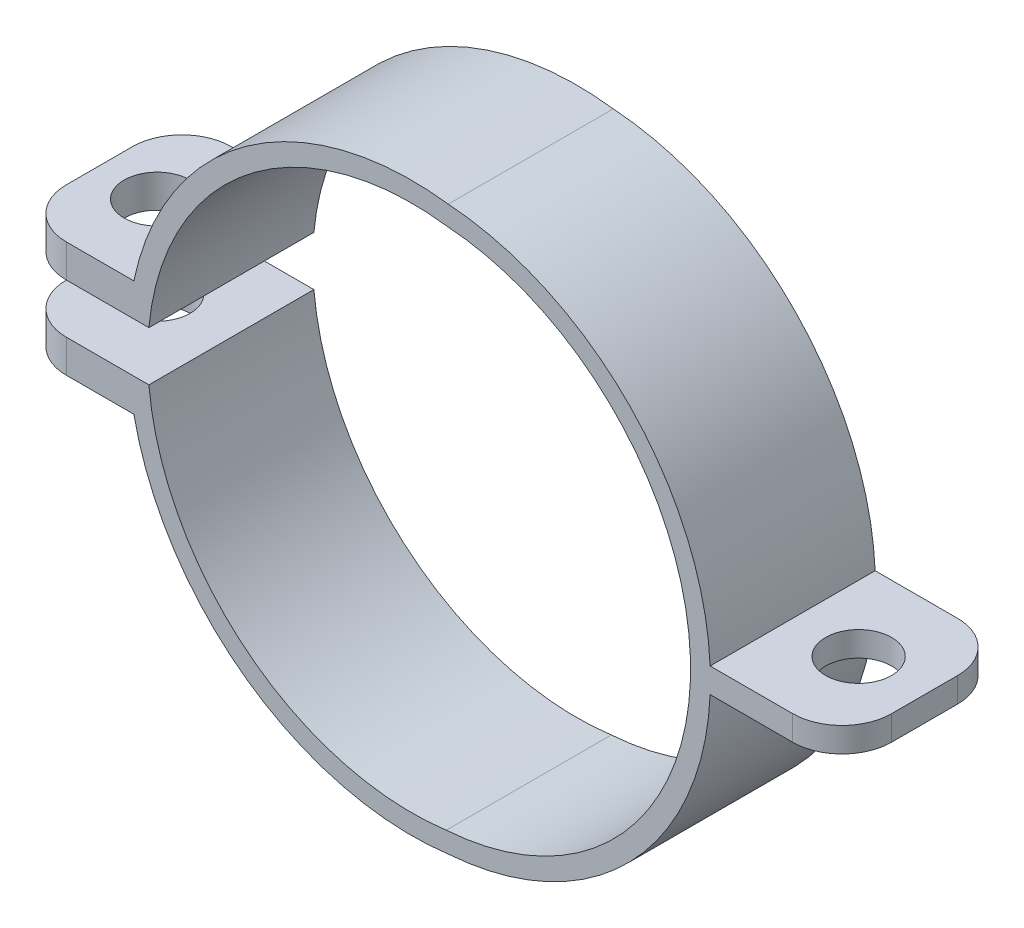
ISO-10303-21;
HEADER;
FILE_DESCRIPTION(('STEP AP214'),'2;1');
FILE_NAME('part.step','',(''),(''),'','','');
FILE_SCHEMA(('AUTOMOTIVE_DESIGN { 1 0 10303 214 1 1 1 1 }'));
ENDSEC;
DATA;
#1=APPLICATION_CONTEXT('core data for automotive mechanical design processes');
#2=APPLICATION_PROTOCOL_DEFINITION('international standard','automotive_design',2000,#1);
#3=PRODUCT_CONTEXT('',#1,'mechanical');
#4=PRODUCT('Part','Part','',(#3));
#5=PRODUCT_RELATED_PRODUCT_CATEGORY('part','',(#4));
#6=PRODUCT_DEFINITION_FORMATION('','',#4);
#7=PRODUCT_DEFINITION_CONTEXT('part definition',#1,'design');
#8=PRODUCT_DEFINITION('design','',#6,#7);
#9=PRODUCT_DEFINITION_SHAPE('','',#8);
#10=(LENGTH_UNIT() NAMED_UNIT(*) SI_UNIT(.MILLI.,.METRE.));
#11=(NAMED_UNIT(*) PLANE_ANGLE_UNIT() SI_UNIT($,.RADIAN.));
#12=(NAMED_UNIT(*) SI_UNIT($,.STERADIAN.) SOLID_ANGLE_UNIT());
#13=UNCERTAINTY_MEASURE_WITH_UNIT(LENGTH_MEASURE(1.E-05),#10,'distance_accuracy_value','');
#14=(GEOMETRIC_REPRESENTATION_CONTEXT(3) GLOBAL_UNCERTAINTY_ASSIGNED_CONTEXT((#13)) GLOBAL_UNIT_ASSIGNED_CONTEXT((#10,
#11,#12)) REPRESENTATION_CONTEXT('',''));
#15=CARTESIAN_POINT('',(0.,0.,0.));
#16=DIRECTION('',(0.,0.,1.));
#17=DIRECTION('',(1.,0.,0.));
#18=AXIS2_PLACEMENT_3D('',#15,#16,#17);
#19=CARTESIAN_POINT('',(0.,0.,-5.));
#20=DIRECTION('',(0.,0.,1.));
#21=DIRECTION('',(1.,0.,0.));
#22=AXIS2_PLACEMENT_3D('',#19,#20,#21);
#23=CYLINDRICAL_SURFACE('',#22,17.1);
#24=DIRECTION('',(0.,0.,1.));
#25=VECTOR('',#24,1.);
#26=CARTESIAN_POINT('',(17.0835447141394,0.75,-5.));
#27=LINE('',#26,#25);
#28=CARTESIAN_POINT('',(17.0835447141394,0.75,-5.));
#29=VERTEX_POINT('',#28);
#30=CARTESIAN_POINT('',(17.0835447141394,0.75,5.));
#31=VERTEX_POINT('',#30);
#32=EDGE_CURVE('E284',#29,#31,#27,.T.);
#33=ORIENTED_EDGE('',*,*,#32,.F.);
#34=CARTESIAN_POINT('',(0.,0.,-5.));
#35=DIRECTION('',(0.,0.,1.));
#36=DIRECTION('',(1.,0.,0.));
#37=AXIS2_PLACEMENT_3D('',#34,#35,#36);
#38=CIRCLE('',#37,17.1);
#39=CARTESIAN_POINT('',(1.21500000000011,17.0567809096558,-5.));
#40=VERTEX_POINT('',#39);
#41=EDGE_CURVE('E241',#29,#40,#38,.T.);
#42=ORIENTED_EDGE('',*,*,#41,.T.);
#43=DIRECTION('',(0.,0.,1.));
#44=VECTOR('',#43,1.);
#45=CARTESIAN_POINT('',(1.21500000000011,17.0567809096558,-5.));
#46=LINE('',#45,#44);
#47=CARTESIAN_POINT('',(1.21500000000011,17.0567809096558,5.));
#48=VERTEX_POINT('',#47);
#49=EDGE_CURVE('E261',#40,#48,#46,.T.);
#50=ORIENTED_EDGE('',*,*,#49,.T.);
#51=CARTESIAN_POINT('',(0.,0.,5.));
#52=DIRECTION('',(0.,0.,1.));
#53=DIRECTION('',(1.,0.,0.));
#54=AXIS2_PLACEMENT_3D('',#51,#52,#53);
#55=CIRCLE('',#54,17.1);
#56=EDGE_CURVE('E212',#31,#48,#55,.T.);
#57=ORIENTED_EDGE('',*,*,#56,.F.);
#58=EDGE_LOOP('',(#33,#42,#50,#57));
#59=FACE_BOUND('',#58,.T.);
#60=ADVANCED_FACE('F33',(#59),#23,.T.);
#61=CARTESIAN_POINT('',(-1.,0.,-5.));
#62=DIRECTION('',(0.,0.,1.));
#63=DIRECTION('',(1.,0.,0.));
#64=AXIS2_PLACEMENT_3D('',#61,#62,#63);
#65=CYLINDRICAL_SURFACE('',#64,16.);
#66=DIRECTION('',(0.,0.,1.));
#67=VECTOR('',#66,1.);
#68=CARTESIAN_POINT('',(1.0950000000001,15.8622499980299,-5.));
#69=LINE('',#68,#67);
#70=CARTESIAN_POINT('',(1.0950000000001,15.8622499980299,-5.));
#71=VERTEX_POINT('',#70);
#72=CARTESIAN_POINT('',(1.0950000000001,15.8622499980299,5.));
#73=VERTEX_POINT('',#72);
#74=EDGE_CURVE('E250',#71,#73,#69,.T.);
#75=ORIENTED_EDGE('',*,*,#74,.T.);
#76=CARTESIAN_POINT('',(-1.,0.,5.));
#77=DIRECTION('',(0.,0.,-1.));
#78=DIRECTION('',(1.,0.,0.));
#79=AXIS2_PLACEMENT_3D('',#76,#77,#78);
#80=CIRCLE('',#79,16.);
#81=CARTESIAN_POINT('',(-16.929532322074,1.5,5.));
#82=VERTEX_POINT('',#81);
#83=EDGE_CURVE('E362',#82,#73,#80,.T.);
#84=ORIENTED_EDGE('',*,*,#83,.F.);
#85=DIRECTION('',(0.,0.,1.));
#86=VECTOR('',#85,1.);
#87=CARTESIAN_POINT('',(-16.929532322074,1.5,-5.));
#88=LINE('',#87,#86);
#89=CARTESIAN_POINT('',(-16.929532322074,1.5,-5.));
#90=VERTEX_POINT('',#89);
#91=EDGE_CURVE('E251',#90,#82,#88,.T.);
#92=ORIENTED_EDGE('',*,*,#91,.F.);
#93=CARTESIAN_POINT('',(-1.,0.,-5.));
#94=DIRECTION('',(0.,0.,-1.));
#95=DIRECTION('',(1.,0.,0.));
#96=AXIS2_PLACEMENT_3D('',#93,#94,#95);
#97=CIRCLE('',#96,16.);
#98=EDGE_CURVE('E224',#90,#71,#97,.T.);
#99=ORIENTED_EDGE('',*,*,#98,.T.);
#100=EDGE_LOOP('',(#75,#84,#92,#99));
#101=FACE_BOUND('',#100,.T.);
#102=ADVANCED_FACE('F358',(#101),#65,.F.);
#103=CARTESIAN_POINT('',(-16.929532322074,1.5,-5.));
#104=DIRECTION('',(0.,-1.,0.));
#105=DIRECTION('',(1.,0.,0.));
#106=AXIS2_PLACEMENT_3D('',#103,#104,#105);
#107=PLANE('',#106);
#108=CARTESIAN_POINT('',(-21.429532322074,1.5,0.));
#109=DIRECTION('',(0.,-1.,0.));
#110=DIRECTION('',(1.,0.,0.));
#111=AXIS2_PLACEMENT_3D('',#108,#109,#110);
#112=CIRCLE('',#111,2.);
#113=CARTESIAN_POINT('',(-19.429532322074,1.5,0.));
#114=VERTEX_POINT('',#113);
#115=EDGE_CURVE('E365',#114,#114,#112,.T.);
#116=ORIENTED_EDGE('',*,*,#115,.F.);
#117=EDGE_LOOP('',(#116));
#118=FACE_BOUND('',#117,.T.);
#119=DIRECTION('',(0.,0.,1.));
#120=VECTOR('',#119,1.);
#121=CARTESIAN_POINT('',(-24.929532322074,1.5,-5.));
#122=LINE('',#121,#120);
#123=CARTESIAN_POINT('',(-24.929532322074,1.5,-2.));
#124=VERTEX_POINT('',#123);
#125=CARTESIAN_POINT('',(-24.929532322074,1.5,2.));
#126=VERTEX_POINT('',#125);
#127=EDGE_CURVE('E255',#124,#126,#122,.T.);
#128=ORIENTED_EDGE('',*,*,#127,.F.);
#129=CARTESIAN_POINT('',(-21.929532322074,1.5,-2.));
#130=DIRECTION('',(0.,-1.,0.));
#131=DIRECTION('',(1.,0.,0.));
#132=AXIS2_PLACEMENT_3D('',#129,#130,#131);
#133=CIRCLE('',#132,3.);
#134=CARTESIAN_POINT('',(-21.929532322074,1.5,-5.));
#135=VERTEX_POINT('',#134);
#136=EDGE_CURVE('E332',#124,#135,#133,.T.);
#137=ORIENTED_EDGE('',*,*,#136,.T.);
#138=DIRECTION('',(1.,0.,0.));
#139=VECTOR('',#138,1.);
#140=CARTESIAN_POINT('',(-16.929532322074,1.5,-5.));
#141=LINE('',#140,#139);
#142=EDGE_CURVE('E248',#135,#90,#141,.T.);
#143=ORIENTED_EDGE('',*,*,#142,.T.);
#144=ORIENTED_EDGE('',*,*,#91,.T.);
#145=DIRECTION('',(1.,0.,0.));
#146=VECTOR('',#145,1.);
#147=CARTESIAN_POINT('',(-16.929532322074,1.5,5.));
#148=LINE('',#147,#146);
#149=CARTESIAN_POINT('',(-21.929532322074,1.5,5.));
#150=VERTEX_POINT('',#149);
#151=EDGE_CURVE('E222',#150,#82,#148,.T.);
#152=ORIENTED_EDGE('',*,*,#151,.F.);
#153=CARTESIAN_POINT('',(-21.929532322074,1.5,2.));
#154=DIRECTION('',(0.,-1.,0.));
#155=DIRECTION('',(1.,0.,0.));
#156=AXIS2_PLACEMENT_3D('',#153,#154,#155);
#157=CIRCLE('',#156,3.);
#158=EDGE_CURVE('E330',#150,#126,#157,.T.);
#159=ORIENTED_EDGE('',*,*,#158,.T.);
#160=EDGE_LOOP('',(#128,#137,#143,#144,#152,#159));
#161=FACE_BOUND('',#160,.T.);
#162=ADVANCED_FACE('F342',(#118,#161),#107,.T.);
#163=CARTESIAN_POINT('',(-24.929532322074,1.5,-5.));
#164=DIRECTION('',(-1.,0.,0.));
#165=DIRECTION('',(0.,0.,1.));
#166=AXIS2_PLACEMENT_3D('',#163,#164,#165);
#167=PLANE('',#166);
#168=DIRECTION('',(0.,0.,1.));
#169=VECTOR('',#168,1.);
#170=CARTESIAN_POINT('',(-24.929532322074,3.5,-5.));
#171=LINE('',#170,#169);
#172=CARTESIAN_POINT('',(-24.929532322074,3.5,-2.));
#173=VERTEX_POINT('',#172);
#174=CARTESIAN_POINT('',(-24.929532322074,3.5,2.));
#175=VERTEX_POINT('',#174);
#176=EDGE_CURVE('E257',#173,#175,#171,.T.);
#177=ORIENTED_EDGE('',*,*,#176,.F.);
#178=DIRECTION('',(0.,-1.,0.));
#179=VECTOR('',#178,1.);
#180=CARTESIAN_POINT('',(-24.929532322074,1.5,-2.));
#181=LINE('',#180,#179);
#182=EDGE_CURVE('E327',#173,#124,#181,.T.);
#183=ORIENTED_EDGE('',*,*,#182,.T.);
#184=ORIENTED_EDGE('',*,*,#127,.T.);
#185=DIRECTION('',(0.,-1.,0.));
#186=VECTOR('',#185,1.);
#187=CARTESIAN_POINT('',(-24.929532322074,1.5,2.));
#188=LINE('',#187,#186);
#189=EDGE_CURVE('E48',#126,#175,#188,.F.);
#190=ORIENTED_EDGE('',*,*,#189,.T.);
#191=EDGE_LOOP('',(#177,#183,#184,#190));
#192=FACE_BOUND('',#191,.T.);
#193=ADVANCED_FACE('F343',(#192),#167,.T.);
#194=CARTESIAN_POINT('',(-24.929532322074,3.5,-5.));
#195=DIRECTION('',(0.,1.,0.));
#196=DIRECTION('',(-1.,0.,0.));
#197=AXIS2_PLACEMENT_3D('',#194,#195,#196);
#198=PLANE('',#197);
#199=CARTESIAN_POINT('',(-21.429532322074,3.5,0.));
#200=DIRECTION('',(0.,1.,0.));
#201=DIRECTION('',(-1.,0.,0.));
#202=AXIS2_PLACEMENT_3D('',#199,#200,#201);
#203=CIRCLE('',#202,2.);
#204=CARTESIAN_POINT('',(-23.429532322074,3.5,0.));
#205=VERTEX_POINT('',#204);
#206=EDGE_CURVE('E370',#205,#205,#203,.T.);
#207=ORIENTED_EDGE('',*,*,#206,.F.);
#208=EDGE_LOOP('',(#207));
#209=FACE_BOUND('',#208,.T.);
#210=DIRECTION('',(-1.,0.,0.));
#211=VECTOR('',#210,1.);
#212=CARTESIAN_POINT('',(-24.929532322074,3.5,-5.));
#213=LINE('',#212,#211);
#214=CARTESIAN_POINT('',(-17.8401306408234,3.5,-5.));
#215=VERTEX_POINT('',#214);
#216=CARTESIAN_POINT('',(-21.929532322074,3.5,-5.));
#217=VERTEX_POINT('',#216);
#218=EDGE_CURVE('E246',#215,#217,#213,.T.);
#219=ORIENTED_EDGE('',*,*,#218,.T.);
#220=CARTESIAN_POINT('',(-21.929532322074,3.5,-2.));
#221=DIRECTION('',(0.,1.,0.));
#222=DIRECTION('',(-1.,0.,0.));
#223=AXIS2_PLACEMENT_3D('',#220,#221,#222);
#224=CIRCLE('',#223,3.);
#225=EDGE_CURVE('E11',#217,#173,#224,.T.);
#226=ORIENTED_EDGE('',*,*,#225,.T.);
#227=ORIENTED_EDGE('',*,*,#176,.T.);
#228=CARTESIAN_POINT('',(-21.929532322074,3.5,2.));
#229=DIRECTION('',(0.,1.,0.));
#230=DIRECTION('',(-1.,0.,0.));
#231=AXIS2_PLACEMENT_3D('',#228,#229,#230);
#232=CIRCLE('',#231,3.);
#233=CARTESIAN_POINT('',(-21.929532322074,3.5,5.));
#234=VERTEX_POINT('',#233);
#235=EDGE_CURVE('E41',#175,#234,#232,.T.);
#236=ORIENTED_EDGE('',*,*,#235,.T.);
#237=DIRECTION('',(-1.,0.,0.));
#238=VECTOR('',#237,1.);
#239=CARTESIAN_POINT('',(-24.929532322074,3.5,5.));
#240=LINE('',#239,#238);
#241=CARTESIAN_POINT('',(-17.8401306408234,3.5,5.));
#242=VERTEX_POINT('',#241);
#243=EDGE_CURVE('E215',#242,#234,#240,.T.);
#244=ORIENTED_EDGE('',*,*,#243,.F.);
#245=DIRECTION('',(0.,0.,1.));
#246=VECTOR('',#245,1.);
#247=CARTESIAN_POINT('',(-17.8401306408234,3.5,-5.));
#248=LINE('',#247,#246);
#249=EDGE_CURVE('E259',#215,#242,#248,.T.);
#250=ORIENTED_EDGE('',*,*,#249,.F.);
#251=EDGE_LOOP('',(#219,#226,#227,#236,#244,#250));
#252=FACE_BOUND('',#251,.T.);
#253=ADVANCED_FACE('F335',(#209,#252),#198,.T.);
#254=CARTESIAN_POINT('',(-1.,0.,-5.));
#255=DIRECTION('',(0.,0.,1.));
#256=DIRECTION('',(1.,0.,0.));
#257=AXIS2_PLACEMENT_3D('',#254,#255,#256);
#258=CYLINDRICAL_SURFACE('',#257,17.2);
#259=ORIENTED_EDGE('',*,*,#249,.T.);
#260=CARTESIAN_POINT('',(-1.,0.,5.));
#261=DIRECTION('',(0.,0.,1.));
#262=DIRECTION('',(1.,0.,0.));
#263=AXIS2_PLACEMENT_3D('',#260,#261,#262);
#264=CIRCLE('',#263,17.2);
#265=EDGE_CURVE('E211',#48,#242,#264,.T.);
#266=ORIENTED_EDGE('',*,*,#265,.F.);
#267=ORIENTED_EDGE('',*,*,#49,.F.);
#268=CARTESIAN_POINT('',(-1.,0.,-5.));
#269=DIRECTION('',(0.,0.,1.));
#270=DIRECTION('',(1.,0.,0.));
#271=AXIS2_PLACEMENT_3D('',#268,#269,#270);
#272=CIRCLE('',#271,17.2);
#273=EDGE_CURVE('E243',#40,#215,#272,.T.);
#274=ORIENTED_EDGE('',*,*,#273,.T.);
#275=EDGE_LOOP('',(#259,#266,#267,#274));
#276=FACE_BOUND('',#275,.T.);
#277=ADVANCED_FACE('F409',(#276),#258,.T.);
#278=DIRECTION('',(0.,0.,1.));
#279=VECTOR('',#278,1.);
#280=CARTESIAN_POINT('',(17.0835447141394,-0.75,-5.));
#281=LINE('',#280,#279);
#282=CARTESIAN_POINT('',(17.0835447141394,-0.75,-5.));
#283=VERTEX_POINT('',#282);
#284=CARTESIAN_POINT('',(17.0835447141394,-0.75,5.));
#285=VERTEX_POINT('',#284);
#286=EDGE_CURVE('E186',#283,#285,#281,.T.);
#287=ORIENTED_EDGE('',*,*,#286,.T.);
#288=CARTESIAN_POINT('',(1.21500000000011,-17.0567809096558,5.));
#289=VERTEX_POINT('',#288);
#290=EDGE_CURVE('E201',#289,#285,#55,.T.);
#291=ORIENTED_EDGE('',*,*,#290,.F.);
#292=DIRECTION('',(0.,0.,1.));
#293=VECTOR('',#292,1.);
#294=CARTESIAN_POINT('',(1.21500000000011,-17.0567809096558,-5.));
#295=LINE('',#294,#293);
#296=CARTESIAN_POINT('',(1.21500000000011,-17.0567809096558,-5.));
#297=VERTEX_POINT('',#296);
#298=EDGE_CURVE('E264',#297,#289,#295,.T.);
#299=ORIENTED_EDGE('',*,*,#298,.F.);
#300=EDGE_CURVE('E203',#297,#283,#38,.T.);
#301=ORIENTED_EDGE('',*,*,#300,.T.);
#302=EDGE_LOOP('',(#287,#291,#299,#301));
#303=FACE_BOUND('',#302,.T.);
#304=ADVANCED_FACE('F200',(#303),#23,.T.);
#305=CARTESIAN_POINT('',(-1.,0.,-5.));
#306=DIRECTION('',(0.,0.,1.));
#307=DIRECTION('',(1.,0.,0.));
#308=AXIS2_PLACEMENT_3D('',#305,#306,#307);
#309=CYLINDRICAL_SURFACE('',#308,17.2);
#310=ORIENTED_EDGE('',*,*,#298,.T.);
#311=CARTESIAN_POINT('',(-1.,0.,5.));
#312=DIRECTION('',(0.,0.,1.));
#313=DIRECTION('',(1.,0.,0.));
#314=AXIS2_PLACEMENT_3D('',#311,#312,#313);
#315=CIRCLE('',#314,17.2);
#316=CARTESIAN_POINT('',(-17.8401306408234,-3.5,5.));
#317=VERTEX_POINT('',#316);
#318=EDGE_CURVE('E210',#317,#289,#315,.T.);
#319=ORIENTED_EDGE('',*,*,#318,.F.);
#320=DIRECTION('',(0.,0.,1.));
#321=VECTOR('',#320,1.);
#322=CARTESIAN_POINT('',(-17.8401306408234,-3.5,-5.));
#323=LINE('',#322,#321);
#324=CARTESIAN_POINT('',(-17.8401306408234,-3.5,-5.));
#325=VERTEX_POINT('',#324);
#326=EDGE_CURVE('E266',#325,#317,#323,.T.);
#327=ORIENTED_EDGE('',*,*,#326,.F.);
#328=CARTESIAN_POINT('',(-1.,0.,-5.));
#329=DIRECTION('',(0.,0.,1.));
#330=DIRECTION('',(1.,0.,0.));
#331=AXIS2_PLACEMENT_3D('',#328,#329,#330);
#332=CIRCLE('',#331,17.2);
#333=EDGE_CURVE('E238',#325,#297,#332,.T.);
#334=ORIENTED_EDGE('',*,*,#333,.T.);
#335=EDGE_LOOP('',(#310,#319,#327,#334));
#336=FACE_BOUND('',#335,.T.);
#337=ADVANCED_FACE('F388',(#336),#309,.T.);
#338=CARTESIAN_POINT('',(-24.929532322074,-3.5,-5.));
#339=DIRECTION('',(0.,-1.,0.));
#340=DIRECTION('',(1.,0.,0.));
#341=AXIS2_PLACEMENT_3D('',#338,#339,#340);
#342=PLANE('',#341);
#343=CARTESIAN_POINT('',(-21.429532322074,-3.5,0.));
#344=DIRECTION('',(0.,-1.,0.));
#345=DIRECTION('',(1.,0.,0.));
#346=AXIS2_PLACEMENT_3D('',#343,#344,#345);
#347=CIRCLE('',#346,2.);
#348=CARTESIAN_POINT('',(-19.429532322074,-3.5,0.));
#349=VERTEX_POINT('',#348);
#350=EDGE_CURVE('E283',#349,#349,#347,.T.);
#351=ORIENTED_EDGE('',*,*,#350,.F.);
#352=EDGE_LOOP('',(#351));
#353=FACE_BOUND('',#352,.T.);
#354=DIRECTION('',(0.,0.,1.));
#355=VECTOR('',#354,1.);
#356=CARTESIAN_POINT('',(-24.929532322074,-3.5,-5.));
#357=LINE('',#356,#355);
#358=CARTESIAN_POINT('',(-24.929532322074,-3.5,-2.));
#359=VERTEX_POINT('',#358);
#360=CARTESIAN_POINT('',(-24.929532322074,-3.5,2.));
#361=VERTEX_POINT('',#360);
#362=EDGE_CURVE('E269',#359,#361,#357,.T.);
#363=ORIENTED_EDGE('',*,*,#362,.F.);
#364=CARTESIAN_POINT('',(-21.929532322074,-3.5,-2.));
#365=DIRECTION('',(0.,-1.,0.));
#366=DIRECTION('',(1.,0.,0.));
#367=AXIS2_PLACEMENT_3D('',#364,#365,#366);
#368=CIRCLE('',#367,3.);
#369=CARTESIAN_POINT('',(-21.929532322074,-3.5,-5.));
#370=VERTEX_POINT('',#369);
#371=EDGE_CURVE('E320',#359,#370,#368,.T.);
#372=ORIENTED_EDGE('',*,*,#371,.T.);
#373=DIRECTION('',(1.,0.,0.));
#374=VECTOR('',#373,1.);
#375=CARTESIAN_POINT('',(-24.929532322074,-3.5,-5.));
#376=LINE('',#375,#374);
#377=EDGE_CURVE('E236',#370,#325,#376,.T.);
#378=ORIENTED_EDGE('',*,*,#377,.T.);
#379=ORIENTED_EDGE('',*,*,#326,.T.);
#380=DIRECTION('',(1.,0.,0.));
#381=VECTOR('',#380,1.);
#382=CARTESIAN_POINT('',(-24.929532322074,-3.5,5.));
#383=LINE('',#382,#381);
#384=CARTESIAN_POINT('',(-21.929532322074,-3.5,5.));
#385=VERTEX_POINT('',#384);
#386=EDGE_CURVE('E378',#385,#317,#383,.T.);
#387=ORIENTED_EDGE('',*,*,#386,.F.);
#388=CARTESIAN_POINT('',(-21.929532322074,-3.5,2.));
#389=DIRECTION('',(0.,-1.,0.));
#390=DIRECTION('',(1.,0.,0.));
#391=AXIS2_PLACEMENT_3D('',#388,#389,#390);
#392=CIRCLE('',#391,3.);
#393=EDGE_CURVE('E318',#385,#361,#392,.T.);
#394=ORIENTED_EDGE('',*,*,#393,.T.);
#395=EDGE_LOOP('',(#363,#372,#378,#379,#387,#394));
#396=FACE_BOUND('',#395,.T.);
#397=ADVANCED_FACE('F384',(#353,#396),#342,.T.);
#398=CARTESIAN_POINT('',(-24.929532322074,-1.5,-5.));
#399=DIRECTION('',(-1.,0.,0.));
#400=DIRECTION('',(0.,0.,1.));
#401=AXIS2_PLACEMENT_3D('',#398,#399,#400);
#402=PLANE('',#401);
#403=DIRECTION('',(0.,0.,1.));
#404=VECTOR('',#403,1.);
#405=CARTESIAN_POINT('',(-24.929532322074,-1.5,-5.));
#406=LINE('',#405,#404);
#407=CARTESIAN_POINT('',(-24.929532322074,-1.5,-2.));
#408=VERTEX_POINT('',#407);
#409=CARTESIAN_POINT('',(-24.929532322074,-1.5,2.));
#410=VERTEX_POINT('',#409);
#411=EDGE_CURVE('E272',#408,#410,#406,.T.);
#412=ORIENTED_EDGE('',*,*,#411,.F.);
#413=DIRECTION('',(0.,-1.,0.));
#414=VECTOR('',#413,1.);
#415=CARTESIAN_POINT('',(-24.929532322074,-3.5,-2.));
#416=LINE('',#415,#414);
#417=EDGE_CURVE('E315',#408,#359,#416,.T.);
#418=ORIENTED_EDGE('',*,*,#417,.T.);
#419=ORIENTED_EDGE('',*,*,#362,.T.);
#420=DIRECTION('',(0.,-1.,0.));
#421=VECTOR('',#420,1.);
#422=CARTESIAN_POINT('',(-24.929532322074,-1.5,2.));
#423=LINE('',#422,#421);
#424=EDGE_CURVE('E313',#361,#410,#423,.F.);
#425=ORIENTED_EDGE('',*,*,#424,.T.);
#426=EDGE_LOOP('',(#412,#418,#419,#425));
#427=FACE_BOUND('',#426,.T.);
#428=ADVANCED_FACE('F434',(#427),#402,.T.);
#429=CARTESIAN_POINT('',(-24.929532322074,-1.5,-5.));
#430=DIRECTION('',(0.,1.,0.));
#431=DIRECTION('',(-1.,0.,0.));
#432=AXIS2_PLACEMENT_3D('',#429,#430,#431);
#433=PLANE('',#432);
#434=CARTESIAN_POINT('',(-21.429532322074,-1.5,0.));
#435=DIRECTION('',(0.,1.,0.));
#436=DIRECTION('',(-1.,0.,0.));
#437=AXIS2_PLACEMENT_3D('',#434,#435,#436);
#438=CIRCLE('',#437,2.);
#439=CARTESIAN_POINT('',(-23.429532322074,-1.5,0.));
#440=VERTEX_POINT('',#439);
#441=EDGE_CURVE('E280',#440,#440,#438,.T.);
#442=ORIENTED_EDGE('',*,*,#441,.F.);
#443=EDGE_LOOP('',(#442));
#444=FACE_BOUND('',#443,.T.);
#445=DIRECTION('',(-1.,0.,0.));
#446=VECTOR('',#445,1.);
#447=CARTESIAN_POINT('',(-24.929532322074,-1.5,-5.));
#448=LINE('',#447,#446);
#449=CARTESIAN_POINT('',(-16.929532322074,-1.5,-5.));
#450=VERTEX_POINT('',#449);
#451=CARTESIAN_POINT('',(-21.929532322074,-1.5,-5.));
#452=VERTEX_POINT('',#451);
#453=EDGE_CURVE('E233',#450,#452,#448,.T.);
#454=ORIENTED_EDGE('',*,*,#453,.T.);
#455=CARTESIAN_POINT('',(-21.929532322074,-1.5,-2.));
#456=DIRECTION('',(0.,1.,0.));
#457=DIRECTION('',(-1.,0.,0.));
#458=AXIS2_PLACEMENT_3D('',#455,#456,#457);
#459=CIRCLE('',#458,3.);
#460=EDGE_CURVE('E324',#452,#408,#459,.T.);
#461=ORIENTED_EDGE('',*,*,#460,.T.);
#462=ORIENTED_EDGE('',*,*,#411,.T.);
#463=CARTESIAN_POINT('',(-21.929532322074,-1.5,2.));
#464=DIRECTION('',(0.,1.,0.));
#465=DIRECTION('',(-1.,0.,0.));
#466=AXIS2_PLACEMENT_3D('',#463,#464,#465);
#467=CIRCLE('',#466,3.);
#468=CARTESIAN_POINT('',(-21.929532322074,-1.5,5.));
#469=VERTEX_POINT('',#468);
#470=EDGE_CURVE('E322',#410,#469,#467,.T.);
#471=ORIENTED_EDGE('',*,*,#470,.T.);
#472=DIRECTION('',(-1.,0.,0.));
#473=VECTOR('',#472,1.);
#474=CARTESIAN_POINT('',(-24.929532322074,-1.5,5.));
#475=LINE('',#474,#473);
#476=CARTESIAN_POINT('',(-16.929532322074,-1.5,5.));
#477=VERTEX_POINT('',#476);
#478=EDGE_CURVE('E376',#477,#469,#475,.T.);
#479=ORIENTED_EDGE('',*,*,#478,.F.);
#480=DIRECTION('',(0.,0.,1.));
#481=VECTOR('',#480,1.);
#482=CARTESIAN_POINT('',(-16.929532322074,-1.5,-5.));
#483=LINE('',#482,#481);
#484=EDGE_CURVE('E275',#450,#477,#483,.T.);
#485=ORIENTED_EDGE('',*,*,#484,.F.);
#486=EDGE_LOOP('',(#454,#461,#462,#471,#479,#485));
#487=FACE_BOUND('',#486,.T.);
#488=ADVANCED_FACE('F440',(#444,#487),#433,.T.);
#489=CARTESIAN_POINT('',(-1.,0.,-5.));
#490=DIRECTION('',(0.,0.,1.));
#491=DIRECTION('',(1.,0.,0.));
#492=AXIS2_PLACEMENT_3D('',#489,#490,#491);
#493=CYLINDRICAL_SURFACE('',#492,16.);
#494=ORIENTED_EDGE('',*,*,#484,.T.);
#495=CARTESIAN_POINT('',(-1.,0.,5.));
#496=DIRECTION('',(0.,0.,-1.));
#497=DIRECTION('',(1.,0.,0.));
#498=AXIS2_PLACEMENT_3D('',#495,#496,#497);
#499=CIRCLE('',#498,16.);
#500=CARTESIAN_POINT('',(1.0950000000001,-15.8622499980299,5.));
#501=VERTEX_POINT('',#500);
#502=EDGE_CURVE('E367',#501,#477,#499,.T.);
#503=ORIENTED_EDGE('',*,*,#502,.F.);
#504=DIRECTION('',(0.,0.,1.));
#505=VECTOR('',#504,1.);
#506=CARTESIAN_POINT('',(1.0950000000001,-15.8622499980299,-5.));
#507=LINE('',#506,#505);
#508=CARTESIAN_POINT('',(1.0950000000001,-15.8622499980299,-5.));
#509=VERTEX_POINT('',#508);
#510=EDGE_CURVE('E277',#509,#501,#507,.T.);
#511=ORIENTED_EDGE('',*,*,#510,.F.);
#512=CARTESIAN_POINT('',(-1.,0.,-5.));
#513=DIRECTION('',(0.,0.,-1.));
#514=DIRECTION('',(1.,0.,0.));
#515=AXIS2_PLACEMENT_3D('',#512,#513,#514);
#516=CIRCLE('',#515,16.);
#517=EDGE_CURVE('E230',#509,#450,#516,.T.);
#518=ORIENTED_EDGE('',*,*,#517,.T.);
#519=EDGE_LOOP('',(#494,#503,#511,#518));
#520=FACE_BOUND('',#519,.T.);
#521=ADVANCED_FACE('F444',(#520),#493,.F.);
#522=CARTESIAN_POINT('',(0.,0.,-5.));
#523=DIRECTION('',(0.,0.,1.));
#524=DIRECTION('',(1.,0.,0.));
#525=AXIS2_PLACEMENT_3D('',#522,#523,#524);
#526=CYLINDRICAL_SURFACE('',#525,15.9);
#527=ORIENTED_EDGE('',*,*,#510,.T.);
#528=CARTESIAN_POINT('',(0.,0.,5.));
#529=DIRECTION('',(0.,0.,-1.));
#530=DIRECTION('',(1.,0.,0.));
#531=AXIS2_PLACEMENT_3D('',#528,#529,#530);
#532=CIRCLE('',#531,15.9);
#533=EDGE_CURVE('E364',#73,#501,#532,.T.);
#534=ORIENTED_EDGE('',*,*,#533,.F.);
#535=ORIENTED_EDGE('',*,*,#74,.F.);
#536=CARTESIAN_POINT('',(0.,0.,-5.));
#537=DIRECTION('',(0.,0.,-1.));
#538=DIRECTION('',(1.,0.,0.));
#539=AXIS2_PLACEMENT_3D('',#536,#537,#538);
#540=CIRCLE('',#539,15.9);
#541=EDGE_CURVE('E227',#71,#509,#540,.T.);
#542=ORIENTED_EDGE('',*,*,#541,.T.);
#543=EDGE_LOOP('',(#527,#534,#535,#542));
#544=FACE_BOUND('',#543,.T.);
#545=ADVANCED_FACE('F448',(#544),#526,.F.);
#546=CARTESIAN_POINT('',(-1.,0.,-5.));
#547=DIRECTION('',(0.,0.,1.));
#548=DIRECTION('',(1.,0.,0.));
#549=AXIS2_PLACEMENT_3D('',#546,#547,#548);
#550=PLANE('',#549);
#551=DIRECTION('',(-1.,0.,0.));
#552=VECTOR('',#551,1.);
#553=CARTESIAN_POINT('',(25.0835447141394,0.750000000000001,-5.));
#554=LINE('',#553,#552);
#555=CARTESIAN_POINT('',(22.0835447141394,0.750000000000001,-5.));
#556=VERTEX_POINT('',#555);
#557=EDGE_CURVE('E205',#556,#29,#554,.T.);
#558=ORIENTED_EDGE('',*,*,#557,.F.);
#559=DIRECTION('',(0.,1.,0.));
#560=VECTOR('',#559,1.);
#561=CARTESIAN_POINT('',(22.0835447141394,-0.749999999999999,-5.));
#562=LINE('',#561,#560);
#563=CARTESIAN_POINT('',(22.0835447141394,-0.749999999999999,-5.));
#564=VERTEX_POINT('',#563);
#565=EDGE_CURVE('E311',#556,#564,#562,.F.);
#566=ORIENTED_EDGE('',*,*,#565,.T.);
#567=DIRECTION('',(1.,0.,0.));
#568=VECTOR('',#567,1.);
#569=CARTESIAN_POINT('',(25.0835447141394,-0.749999999999999,-5.));
#570=LINE('',#569,#568);
#571=EDGE_CURVE('E389',#283,#564,#570,.T.);
#572=ORIENTED_EDGE('',*,*,#571,.F.);
#573=ORIENTED_EDGE('',*,*,#300,.F.);
#574=ORIENTED_EDGE('',*,*,#333,.F.);
#575=ORIENTED_EDGE('',*,*,#377,.F.);
#576=DIRECTION('',(0.,-1.,0.));
#577=VECTOR('',#576,1.);
#578=CARTESIAN_POINT('',(-21.929532322074,-1.5,-5.));
#579=LINE('',#578,#577);
#580=EDGE_CURVE('E309',#370,#452,#579,.F.);
#581=ORIENTED_EDGE('',*,*,#580,.T.);
#582=ORIENTED_EDGE('',*,*,#453,.F.);
#583=ORIENTED_EDGE('',*,*,#517,.F.);
#584=ORIENTED_EDGE('',*,*,#541,.F.);
#585=ORIENTED_EDGE('',*,*,#98,.F.);
#586=ORIENTED_EDGE('',*,*,#142,.F.);
#587=DIRECTION('',(0.,-1.,0.));
#588=VECTOR('',#587,1.);
#589=CARTESIAN_POINT('',(-21.929532322074,3.5,-5.));
#590=LINE('',#589,#588);
#591=EDGE_CURVE('E307',#135,#217,#590,.F.);
#592=ORIENTED_EDGE('',*,*,#591,.T.);
#593=ORIENTED_EDGE('',*,*,#218,.F.);
#594=ORIENTED_EDGE('',*,*,#273,.F.);
#595=ORIENTED_EDGE('',*,*,#41,.F.);
#596=EDGE_LOOP('',(#558,#566,#572,#573,#574,#575,#581,#582,#583,#584,#585,#586,#592,#593,#594,#595));
#597=FACE_BOUND('',#596,.T.);
#598=ADVANCED_FACE('F353',(#597),#550,.F.);
#599=CARTESIAN_POINT('',(-1.,0.,5.));
#600=DIRECTION('',(0.,0.,1.));
#601=DIRECTION('',(1.,0.,0.));
#602=AXIS2_PLACEMENT_3D('',#599,#600,#601);
#603=PLANE('',#602);
#604=DIRECTION('',(1.,0.,0.));
#605=VECTOR('',#604,1.);
#606=CARTESIAN_POINT('',(25.0835447141394,-0.749999999999999,5.));
#607=LINE('',#606,#605);
#608=CARTESIAN_POINT('',(22.0835447141394,-0.749999999999999,5.));
#609=VERTEX_POINT('',#608);
#610=EDGE_CURVE('E181',#285,#609,#607,.T.);
#611=ORIENTED_EDGE('',*,*,#610,.T.);
#612=DIRECTION('',(0.,1.,0.));
#613=VECTOR('',#612,1.);
#614=CARTESIAN_POINT('',(22.0835447141394,0.,5.));
#615=LINE('',#614,#613);
#616=CARTESIAN_POINT('',(22.0835447141394,0.750000000000001,5.));
#617=VERTEX_POINT('',#616);
#618=EDGE_CURVE('E293',#609,#617,#615,.T.);
#619=ORIENTED_EDGE('',*,*,#618,.T.);
#620=DIRECTION('',(-1.,0.,0.));
#621=VECTOR('',#620,1.);
#622=CARTESIAN_POINT('',(25.0835447141394,0.750000000000001,5.));
#623=LINE('',#622,#621);
#624=EDGE_CURVE('E194',#617,#31,#623,.T.);
#625=ORIENTED_EDGE('',*,*,#624,.T.);
#626=ORIENTED_EDGE('',*,*,#56,.T.);
#627=ORIENTED_EDGE('',*,*,#265,.T.);
#628=ORIENTED_EDGE('',*,*,#243,.T.);
#629=DIRECTION('',(0.,-1.,0.));
#630=VECTOR('',#629,1.);
#631=CARTESIAN_POINT('',(-21.929532322074,0.,5.));
#632=LINE('',#631,#630);
#633=EDGE_CURVE('E254',#234,#150,#632,.T.);
#634=ORIENTED_EDGE('',*,*,#633,.T.);
#635=ORIENTED_EDGE('',*,*,#151,.T.);
#636=ORIENTED_EDGE('',*,*,#83,.T.);
#637=ORIENTED_EDGE('',*,*,#533,.T.);
#638=ORIENTED_EDGE('',*,*,#502,.T.);
#639=ORIENTED_EDGE('',*,*,#478,.T.);
#640=DIRECTION('',(0.,-1.,0.));
#641=VECTOR('',#640,1.);
#642=CARTESIAN_POINT('',(-21.929532322074,0.,5.));
#643=LINE('',#642,#641);
#644=EDGE_CURVE('E290',#469,#385,#643,.T.);
#645=ORIENTED_EDGE('',*,*,#644,.T.);
#646=ORIENTED_EDGE('',*,*,#386,.T.);
#647=ORIENTED_EDGE('',*,*,#318,.T.);
#648=ORIENTED_EDGE('',*,*,#290,.T.);
#649=EDGE_LOOP('',(#611,#619,#625,#626,#627,#628,#634,#635,#636,#637,#638,#639,#645,#646,#647,#648));
#650=FACE_BOUND('',#649,.T.);
#651=ADVANCED_FACE('F208',(#650),#603,.T.);
#652=CARTESIAN_POINT('',(-21.429532322074,-17.2,0.));
#653=DIRECTION('',(0.,1.,0.));
#654=DIRECTION('',(-1.,0.,0.));
#655=AXIS2_PLACEMENT_3D('',#652,#653,#654);
#656=CYLINDRICAL_SURFACE('',#655,2.);
#657=ORIENTED_EDGE('',*,*,#350,.T.);
#658=EDGE_LOOP('',(#657));
#659=FACE_BOUND('',#658,.T.);
#660=ORIENTED_EDGE('',*,*,#441,.T.);
#661=EDGE_LOOP('',(#660));
#662=FACE_BOUND('',#661,.T.);
#663=ADVANCED_FACE('F554',(#659,#662),#656,.F.);
#664=ORIENTED_EDGE('',*,*,#115,.T.);
#665=EDGE_LOOP('',(#664));
#666=FACE_BOUND('',#665,.T.);
#667=ORIENTED_EDGE('',*,*,#206,.T.);
#668=EDGE_LOOP('',(#667));
#669=FACE_BOUND('',#668,.T.);
#670=ADVANCED_FACE('F406',(#666,#669),#656,.F.);
#671=CARTESIAN_POINT('',(25.0835447141394,0.750000000000001,-5.));
#672=DIRECTION('',(0.,1.,0.));
#673=DIRECTION('',(-1.,0.,0.));
#674=AXIS2_PLACEMENT_3D('',#671,#672,#673);
#675=PLANE('',#674);
#676=CARTESIAN_POINT('',(21.0835447141394,0.750000000000001,0.));
#677=DIRECTION('',(0.,1.,0.));
#678=DIRECTION('',(-1.,0.,0.));
#679=AXIS2_PLACEMENT_3D('',#676,#677,#678);
#680=CIRCLE('',#679,2.);
#681=CARTESIAN_POINT('',(19.0835447141394,0.75,0.));
#682=VERTEX_POINT('',#681);
#683=EDGE_CURVE('E195',#682,#682,#680,.T.);
#684=ORIENTED_EDGE('',*,*,#683,.F.);
#685=EDGE_LOOP('',(#684));
#686=FACE_BOUND('',#685,.T.);
#687=ORIENTED_EDGE('',*,*,#624,.F.);
#688=CARTESIAN_POINT('',(22.0835447141394,0.750000000000001,2.));
#689=DIRECTION('',(0.,1.,0.));
#690=DIRECTION('',(-1.,0.,0.));
#691=AXIS2_PLACEMENT_3D('',#688,#689,#690);
#692=CIRCLE('',#691,3.);
#693=CARTESIAN_POINT('',(25.0835447141394,0.750000000000001,2.));
#694=VERTEX_POINT('',#693);
#695=EDGE_CURVE('E297',#617,#694,#692,.T.);
#696=ORIENTED_EDGE('',*,*,#695,.T.);
#697=DIRECTION('',(0.,0.,1.));
#698=VECTOR('',#697,1.);
#699=CARTESIAN_POINT('',(25.0835447141394,0.750000000000001,-5.));
#700=LINE('',#699,#698);
#701=CARTESIAN_POINT('',(25.0835447141394,0.750000000000001,-2.));
#702=VERTEX_POINT('',#701);
#703=EDGE_CURVE('E398',#702,#694,#700,.T.);
#704=ORIENTED_EDGE('',*,*,#703,.F.);
#705=CARTESIAN_POINT('',(22.0835447141394,0.750000000000001,-2.));
#706=DIRECTION('',(0.,1.,0.));
#707=DIRECTION('',(-1.,0.,0.));
#708=AXIS2_PLACEMENT_3D('',#705,#706,#707);
#709=CIRCLE('',#708,3.);
#710=EDGE_CURVE('E295',#702,#556,#709,.T.);
#711=ORIENTED_EDGE('',*,*,#710,.T.);
#712=ORIENTED_EDGE('',*,*,#557,.T.);
#713=ORIENTED_EDGE('',*,*,#32,.T.);
#714=EDGE_LOOP('',(#687,#696,#704,#711,#712,#713));
#715=FACE_BOUND('',#714,.T.);
#716=ADVANCED_FACE('F534',(#686,#715),#675,.T.);
#717=CARTESIAN_POINT('',(25.0835447141394,-0.749999999999999,-5.));
#718=DIRECTION('',(1.,0.,0.));
#719=DIRECTION('',(0.,0.,-1.));
#720=AXIS2_PLACEMENT_3D('',#717,#718,#719);
#721=PLANE('',#720);
#722=ORIENTED_EDGE('',*,*,#703,.T.);
#723=DIRECTION('',(0.,1.,0.));
#724=VECTOR('',#723,1.);
#725=CARTESIAN_POINT('',(25.0835447141394,-0.749999999999999,2.));
#726=LINE('',#725,#724);
#727=CARTESIAN_POINT('',(25.0835447141394,-0.749999999999999,2.));
#728=VERTEX_POINT('',#727);
#729=EDGE_CURVE('E302',#694,#728,#726,.F.);
#730=ORIENTED_EDGE('',*,*,#729,.T.);
#731=DIRECTION('',(0.,0.,1.));
#732=VECTOR('',#731,1.);
#733=CARTESIAN_POINT('',(25.0835447141394,-0.749999999999999,-5.));
#734=LINE('',#733,#732);
#735=CARTESIAN_POINT('',(25.0835447141394,-0.749999999999999,-2.));
#736=VERTEX_POINT('',#735);
#737=EDGE_CURVE('E204',#736,#728,#734,.T.);
#738=ORIENTED_EDGE('',*,*,#737,.F.);
#739=DIRECTION('',(0.,1.,0.));
#740=VECTOR('',#739,1.);
#741=CARTESIAN_POINT('',(25.0835447141394,0.750000000000001,-2.));
#742=LINE('',#741,#740);
#743=EDGE_CURVE('E299',#736,#702,#742,.T.);
#744=ORIENTED_EDGE('',*,*,#743,.T.);
#745=EDGE_LOOP('',(#722,#730,#738,#744));
#746=FACE_BOUND('',#745,.T.);
#747=ADVANCED_FACE('F524',(#746),#721,.T.);
#748=CARTESIAN_POINT('',(25.0835447141394,-0.749999999999999,-5.));
#749=DIRECTION('',(0.,-1.,0.));
#750=DIRECTION('',(1.,0.,0.));
#751=AXIS2_PLACEMENT_3D('',#748,#749,#750);
#752=PLANE('',#751);
#753=CARTESIAN_POINT('',(21.0835447141394,-0.750000000000001,0.));
#754=DIRECTION('',(0.,-1.,0.));
#755=DIRECTION('',(1.,0.,0.));
#756=AXIS2_PLACEMENT_3D('',#753,#754,#755);
#757=CIRCLE('',#756,2.);
#758=CARTESIAN_POINT('',(23.0835447141394,-0.75,0.));
#759=VERTEX_POINT('',#758);
#760=EDGE_CURVE('E285',#759,#759,#757,.T.);
#761=ORIENTED_EDGE('',*,*,#760,.F.);
#762=EDGE_LOOP('',(#761));
#763=FACE_BOUND('',#762,.T.);
#764=ORIENTED_EDGE('',*,*,#737,.T.);
#765=CARTESIAN_POINT('',(22.0835447141394,-0.749999999999999,2.));
#766=DIRECTION('',(0.,-1.,0.));
#767=DIRECTION('',(1.,0.,0.));
#768=AXIS2_PLACEMENT_3D('',#765,#766,#767);
#769=CIRCLE('',#768,3.);
#770=EDGE_CURVE('E189',#728,#609,#769,.T.);
#771=ORIENTED_EDGE('',*,*,#770,.T.);
#772=ORIENTED_EDGE('',*,*,#610,.F.);
#773=ORIENTED_EDGE('',*,*,#286,.F.);
#774=ORIENTED_EDGE('',*,*,#571,.T.);
#775=CARTESIAN_POINT('',(22.0835447141394,-0.749999999999999,-2.));
#776=DIRECTION('',(0.,-1.,0.));
#777=DIRECTION('',(1.,0.,0.));
#778=AXIS2_PLACEMENT_3D('',#775,#776,#777);
#779=CIRCLE('',#778,3.);
#780=EDGE_CURVE('E304',#564,#736,#779,.T.);
#781=ORIENTED_EDGE('',*,*,#780,.T.);
#782=EDGE_LOOP('',(#764,#771,#772,#773,#774,#781));
#783=FACE_BOUND('',#782,.T.);
#784=ADVANCED_FACE('F184',(#763,#783),#752,.T.);
#785=CARTESIAN_POINT('',(21.0835447141394,-17.2,0.));
#786=DIRECTION('',(0.,1.,0.));
#787=DIRECTION('',(-1.,0.,0.));
#788=AXIS2_PLACEMENT_3D('',#785,#786,#787);
#789=CYLINDRICAL_SURFACE('',#788,2.);
#790=ORIENTED_EDGE('',*,*,#683,.T.);
#791=EDGE_LOOP('',(#790));
#792=FACE_BOUND('',#791,.T.);
#793=ORIENTED_EDGE('',*,*,#760,.T.);
#794=EDGE_LOOP('',(#793));
#795=FACE_BOUND('',#794,.T.);
#796=ADVANCED_FACE('F457',(#792,#795),#789,.F.);
#797=CARTESIAN_POINT('',(22.0835447141394,0.,2.));
#798=DIRECTION('',(0.,1.,0.));
#799=DIRECTION('',(0.,0.,1.));
#800=AXIS2_PLACEMENT_3D('',#797,#798,#799);
#801=CYLINDRICAL_SURFACE('',#800,3.);
#802=ORIENTED_EDGE('',*,*,#770,.F.);
#803=ORIENTED_EDGE('',*,*,#729,.F.);
#804=ORIENTED_EDGE('',*,*,#695,.F.);
#805=ORIENTED_EDGE('',*,*,#618,.F.);
#806=EDGE_LOOP('',(#802,#803,#804,#805));
#807=FACE_BOUND('',#806,.T.);
#808=ADVANCED_FACE('F453',(#807),#801,.T.);
#809=CARTESIAN_POINT('',(22.0835447141394,-0.749999999999999,-2.));
#810=DIRECTION('',(0.,-1.,0.));
#811=DIRECTION('',(0.,0.,-1.));
#812=AXIS2_PLACEMENT_3D('',#809,#810,#811);
#813=CYLINDRICAL_SURFACE('',#812,3.);
#814=ORIENTED_EDGE('',*,*,#780,.F.);
#815=ORIENTED_EDGE('',*,*,#565,.F.);
#816=ORIENTED_EDGE('',*,*,#710,.F.);
#817=ORIENTED_EDGE('',*,*,#743,.F.);
#818=EDGE_LOOP('',(#814,#815,#816,#817));
#819=FACE_BOUND('',#818,.T.);
#820=ADVANCED_FACE('F456',(#819),#813,.T.);
#821=CARTESIAN_POINT('',(-21.929532322074,-1.5,-2.));
#822=DIRECTION('',(0.,1.,0.));
#823=DIRECTION('',(0.,0.,1.));
#824=AXIS2_PLACEMENT_3D('',#821,#822,#823);
#825=CYLINDRICAL_SURFACE('',#824,3.);
#826=ORIENTED_EDGE('',*,*,#460,.F.);
#827=ORIENTED_EDGE('',*,*,#580,.F.);
#828=ORIENTED_EDGE('',*,*,#371,.F.);
#829=ORIENTED_EDGE('',*,*,#417,.F.);
#830=EDGE_LOOP('',(#826,#827,#828,#829));
#831=FACE_BOUND('',#830,.T.);
#832=ADVANCED_FACE('F461',(#831),#825,.T.);
#833=CARTESIAN_POINT('',(-21.929532322074,1.5,-2.));
#834=DIRECTION('',(0.,1.,0.));
#835=DIRECTION('',(0.,0.,1.));
#836=AXIS2_PLACEMENT_3D('',#833,#834,#835);
#837=CYLINDRICAL_SURFACE('',#836,3.);
#838=ORIENTED_EDGE('',*,*,#225,.F.);
#839=ORIENTED_EDGE('',*,*,#591,.F.);
#840=ORIENTED_EDGE('',*,*,#136,.F.);
#841=ORIENTED_EDGE('',*,*,#182,.F.);
#842=EDGE_LOOP('',(#838,#839,#840,#841));
#843=FACE_BOUND('',#842,.T.);
#844=ADVANCED_FACE('F346',(#843),#837,.T.);
#845=CARTESIAN_POINT('',(-21.929532322074,0.,2.));
#846=DIRECTION('',(0.,-1.,0.));
#847=DIRECTION('',(0.,0.,-1.));
#848=AXIS2_PLACEMENT_3D('',#845,#846,#847);
#849=CYLINDRICAL_SURFACE('',#848,3.);
#850=ORIENTED_EDGE('',*,*,#470,.F.);
#851=ORIENTED_EDGE('',*,*,#424,.F.);
#852=ORIENTED_EDGE('',*,*,#393,.F.);
#853=ORIENTED_EDGE('',*,*,#644,.F.);
#854=EDGE_LOOP('',(#850,#851,#852,#853));
#855=FACE_BOUND('',#854,.T.);
#856=ADVANCED_FACE('F467',(#855),#849,.T.);
#857=CARTESIAN_POINT('',(-21.929532322074,0.,2.));
#858=DIRECTION('',(0.,-1.,0.));
#859=DIRECTION('',(0.,0.,-1.));
#860=AXIS2_PLACEMENT_3D('',#857,#858,#859);
#861=CYLINDRICAL_SURFACE('',#860,3.);
#862=ORIENTED_EDGE('',*,*,#235,.F.);
#863=ORIENTED_EDGE('',*,*,#189,.F.);
#864=ORIENTED_EDGE('',*,*,#158,.F.);
#865=ORIENTED_EDGE('',*,*,#633,.F.);
#866=EDGE_LOOP('',(#862,#863,#864,#865));
#867=FACE_BOUND('',#866,.T.);
#868=ADVANCED_FACE('F35',(#867),#861,.T.);
#869=CLOSED_SHELL('',(#60,#102,#162,#193,#253,#277,#304,#337,#397,#428,#488,#521,#545,#598,#651,
#663,#670,#716,#747,#784,#796,#808,#820,#832,#844,#856,#868));
#870=MANIFOLD_SOLID_BREP('B2',#869);
#871=ADVANCED_BREP_SHAPE_REPRESENTATION('',(#18,#870),#14);
#872=SHAPE_DEFINITION_REPRESENTATION(#9,#871);
ENDSEC;
END-ISO-10303-21;
